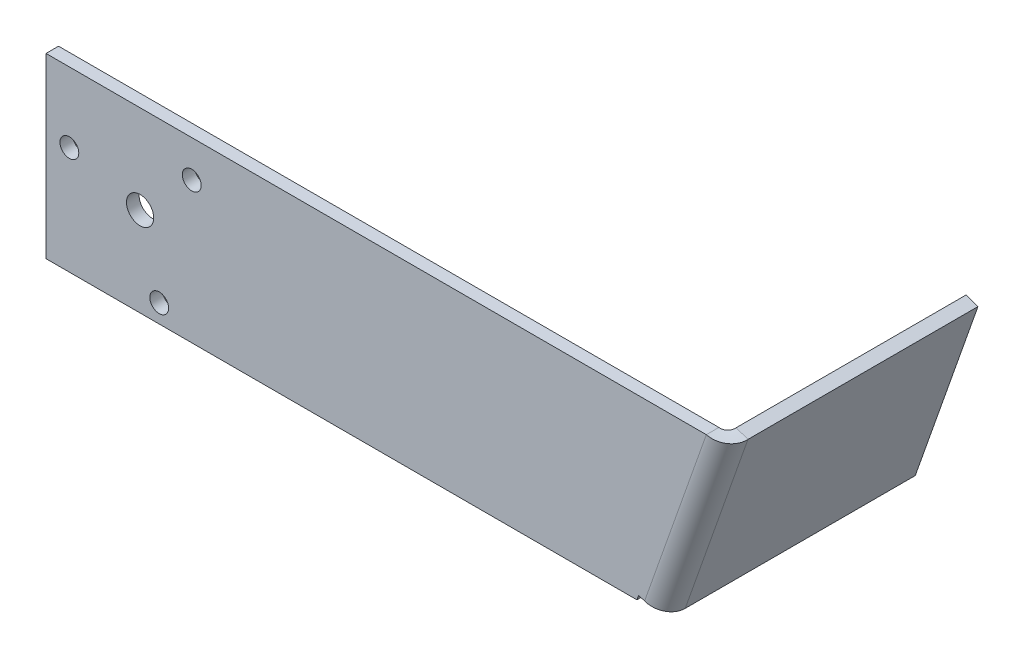
ISO-10303-21;
HEADER;
FILE_DESCRIPTION(('STEP AP214'),'2;1');
FILE_NAME('part.step','',(''),(''),'','','');
FILE_SCHEMA(('AUTOMOTIVE_DESIGN { 1 0 10303 214 1 1 1 1 }'));
ENDSEC;
DATA;
#1=APPLICATION_CONTEXT('core data for automotive mechanical design processes');
#2=APPLICATION_PROTOCOL_DEFINITION('international standard','automotive_design',2000,#1);
#3=PRODUCT_CONTEXT('',#1,'mechanical');
#4=PRODUCT('Part','Part','',(#3));
#5=PRODUCT_RELATED_PRODUCT_CATEGORY('part','',(#4));
#6=PRODUCT_DEFINITION_FORMATION('','',#4);
#7=PRODUCT_DEFINITION_CONTEXT('part definition',#1,'design');
#8=PRODUCT_DEFINITION('design','',#6,#7);
#9=PRODUCT_DEFINITION_SHAPE('','',#8);
#10=(LENGTH_UNIT() NAMED_UNIT(*) SI_UNIT(.MILLI.,.METRE.));
#11=(NAMED_UNIT(*) PLANE_ANGLE_UNIT() SI_UNIT($,.RADIAN.));
#12=(NAMED_UNIT(*) SI_UNIT($,.STERADIAN.) SOLID_ANGLE_UNIT());
#13=UNCERTAINTY_MEASURE_WITH_UNIT(LENGTH_MEASURE(1.E-05),#10,'distance_accuracy_value','');
#14=(GEOMETRIC_REPRESENTATION_CONTEXT(3) GLOBAL_UNCERTAINTY_ASSIGNED_CONTEXT((#13)) GLOBAL_UNIT_ASSIGNED_CONTEXT((#10,
#11,#12)) REPRESENTATION_CONTEXT('',''));
#15=CARTESIAN_POINT('',(0.,0.,0.));
#16=DIRECTION('',(0.,0.,1.));
#17=DIRECTION('',(1.,0.,0.));
#18=AXIS2_PLACEMENT_3D('',#15,#16,#17);
#19=CARTESIAN_POINT('',(0.,-85.,-6.));
#20=DIRECTION('',(0.,-1.,0.));
#21=DIRECTION('',(1.,0.,0.));
#22=AXIS2_PLACEMENT_3D('',#19,#20,#21);
#23=PLANE('',#22);
#24=DIRECTION('',(1.,0.,0.));
#25=VECTOR('',#24,1.);
#26=CARTESIAN_POINT('',(0.,-85.,-6.));
#27=LINE('',#26,#25);
#28=CARTESIAN_POINT('',(0.,-85.,-6.));
#29=VERTEX_POINT('',#28);
#30=CARTESIAN_POINT('',(282.576806197574,-85.,-6.00000000000002));
#31=VERTEX_POINT('',#30);
#32=EDGE_CURVE('E131',#29,#31,#27,.T.);
#33=ORIENTED_EDGE('',*,*,#32,.T.);
#34=DIRECTION('',(0.,0.,1.));
#35=VECTOR('',#34,1.);
#36=CARTESIAN_POINT('',(282.576806197574,-85.,-6.));
#37=LINE('',#36,#35);
#38=CARTESIAN_POINT('',(282.576806197574,-85.,0.));
#39=VERTEX_POINT('',#38);
#40=EDGE_CURVE('E91',#31,#39,#37,.T.);
#41=ORIENTED_EDGE('',*,*,#40,.T.);
#42=DIRECTION('',(1.,0.,0.));
#43=VECTOR('',#42,1.);
#44=CARTESIAN_POINT('',(0.,-85.,0.));
#45=LINE('',#44,#43);
#46=CARTESIAN_POINT('',(0.,-85.,0.));
#47=VERTEX_POINT('',#46);
#48=EDGE_CURVE('E81',#47,#39,#45,.T.);
#49=ORIENTED_EDGE('',*,*,#48,.F.);
#50=DIRECTION('',(0.,0.,1.));
#51=VECTOR('',#50,1.);
#52=CARTESIAN_POINT('',(0.,-85.,-6.));
#53=LINE('',#52,#51);
#54=EDGE_CURVE('E88',#29,#47,#53,.T.);
#55=ORIENTED_EDGE('',*,*,#54,.F.);
#56=EDGE_LOOP('',(#33,#41,#49,#55));
#57=FACE_BOUND('',#56,.T.);
#58=ADVANCED_FACE('F34',(#57),#23,.T.);
#59=CARTESIAN_POINT('',(0.,-85.,-6.));
#60=DIRECTION('',(0.,0.,1.));
#61=DIRECTION('',(1.,0.,0.));
#62=AXIS2_PLACEMENT_3D('',#59,#60,#61);
#63=PLANE('',#62);
#64=CARTESIAN_POINT('',(54.1334086420687,-76.1877716395285,-6.));
#65=DIRECTION('',(0.,0.,1.));
#66=DIRECTION('',(1.,0.,0.));
#67=AXIS2_PLACEMENT_3D('',#64,#65,#66);
#68=CIRCLE('',#67,4.5);
#69=CARTESIAN_POINT('',(58.6334086420687,-76.1877716395285,-6.));
#70=VERTEX_POINT('',#69);
#71=EDGE_CURVE('E328',#70,#70,#68,.T.);
#72=ORIENTED_EDGE('',*,*,#71,.T.);
#73=EDGE_LOOP('',(#72));
#74=FACE_BOUND('',#73,.T.);
#75=CARTESIAN_POINT('',(11.172645738598,-33.4166031875001,-6.));
#76=DIRECTION('',(0.,0.,1.));
#77=DIRECTION('',(1.,0.,0.));
#78=AXIS2_PLACEMENT_3D('',#75,#76,#77);
#79=CIRCLE('',#78,4.5);
#80=CARTESIAN_POINT('',(15.672645738598,-33.4166031875001,-6.));
#81=VERTEX_POINT('',#80);
#82=EDGE_CURVE('E322',#81,#81,#79,.T.);
#83=ORIENTED_EDGE('',*,*,#82,.T.);
#84=EDGE_LOOP('',(#83));
#85=FACE_BOUND('',#84,.T.);
#86=CARTESIAN_POINT('',(69.6939456193336,-17.5970753731488,-6.));
#87=DIRECTION('',(0.,0.,1.));
#88=DIRECTION('',(1.,0.,0.));
#89=AXIS2_PLACEMENT_3D('',#86,#87,#88);
#90=CIRCLE('',#89,4.5);
#91=CARTESIAN_POINT('',(74.1939456193336,-17.5970753731488,-6.));
#92=VERTEX_POINT('',#91);
#93=EDGE_CURVE('E314',#92,#92,#90,.T.);
#94=ORIENTED_EDGE('',*,*,#93,.T.);
#95=EDGE_LOOP('',(#94));
#96=FACE_BOUND('',#95,.T.);
#97=CARTESIAN_POINT('',(45.,-42.4004834000591,-6.));
#98=DIRECTION('',(0.,0.,1.));
#99=DIRECTION('',(1.,0.,0.));
#100=AXIS2_PLACEMENT_3D('',#97,#98,#99);
#101=CIRCLE('',#100,6.5);
#102=CARTESIAN_POINT('',(51.5,-42.4004834000591,-6.));
#103=VERTEX_POINT('',#102);
#104=EDGE_CURVE('E271',#103,#103,#101,.T.);
#105=ORIENTED_EDGE('',*,*,#104,.T.);
#106=EDGE_LOOP('',(#105));
#107=FACE_BOUND('',#106,.T.);
#108=DIRECTION('',(0.332820117735131,0.942990333582892,0.));
#109=VECTOR('',#108,1.);
#110=CARTESIAN_POINT('',(282.400607311714,-85.4992301766027,-6.00000000000002));
#111=LINE('',#110,#109);
#112=CARTESIAN_POINT('',(283.39906766492,-82.6702591758541,-6.00000000000002));
#113=VERTEX_POINT('',#112);
#114=EDGE_CURVE('E95',#31,#113,#111,.T.);
#115=ORIENTED_EDGE('',*,*,#114,.F.);
#116=ORIENTED_EDGE('',*,*,#32,.F.);
#117=DIRECTION('',(0.,-1.,0.));
#118=VECTOR('',#117,1.);
#119=CARTESIAN_POINT('',(0.,0.,-6.));
#120=LINE('',#119,#118);
#121=CARTESIAN_POINT('',(0.,0.,-6.));
#122=VERTEX_POINT('',#121);
#123=EDGE_CURVE('E80',#122,#29,#120,.T.);
#124=ORIENTED_EDGE('',*,*,#123,.F.);
#125=DIRECTION('',(-1.,0.,0.));
#126=VECTOR('',#125,1.);
#127=CARTESIAN_POINT('',(0.,0.,-6.));
#128=LINE('',#127,#126);
#129=CARTESIAN_POINT('',(315.758174970042,0.,-6.00000000000002));
#130=VERTEX_POINT('',#129);
#131=EDGE_CURVE('E58',#130,#122,#128,.T.);
#132=ORIENTED_EDGE('',*,*,#131,.F.);
#133=DIRECTION('',(-0.332820117735138,-0.942990333582889,0.));
#134=VECTOR('',#133,1.);
#135=CARTESIAN_POINT('',(286.228038665668,-83.6687195290595,-6.00000000000002));
#136=LINE('',#135,#134);
#137=CARTESIAN_POINT('',(286.228038665668,-83.6687195290595,-6.00000000000002));
#138=VERTEX_POINT('',#137);
#139=EDGE_CURVE('E149',#138,#130,#136,.F.);
#140=ORIENTED_EDGE('',*,*,#139,.F.);
#141=DIRECTION('',(0.94299033358289,-0.332820117735136,0.));
#142=VECTOR('',#141,1.);
#143=CARTESIAN_POINT('',(283.39906766492,-82.6702591758541,-6.00000000000002));
#144=LINE('',#143,#142);
#145=EDGE_CURVE('E124',#113,#138,#144,.T.);
#146=ORIENTED_EDGE('',*,*,#145,.F.);
#147=EDGE_LOOP('',(#115,#116,#124,#132,#140,#146));
#148=FACE_BOUND('',#147,.T.);
#149=ADVANCED_FACE('F137',(#74,#85,#96,#107,#148),#63,.F.);
#150=CARTESIAN_POINT('',(0.,-85.,0.));
#151=DIRECTION('',(0.,0.,1.));
#152=DIRECTION('',(1.,0.,0.));
#153=AXIS2_PLACEMENT_3D('',#150,#151,#152);
#154=PLANE('',#153);
#155=CARTESIAN_POINT('',(54.1334086420687,-76.1877716395285,0.));
#156=DIRECTION('',(0.,0.,1.));
#157=DIRECTION('',(-0.499999999999992,-0.866025403784443,0.));
#158=AXIS2_PLACEMENT_3D('',#155,#156,#157);
#159=CIRCLE('',#158,4.5);
#160=CARTESIAN_POINT('',(51.8834086420687,-80.0848859565585,0.));
#161=VERTEX_POINT('',#160);
#162=EDGE_CURVE('E331',#161,#161,#159,.T.);
#163=ORIENTED_EDGE('',*,*,#162,.F.);
#164=EDGE_LOOP('',(#163));
#165=FACE_BOUND('',#164,.T.);
#166=CARTESIAN_POINT('',(11.172645738598,-33.4166031875001,0.));
#167=DIRECTION('',(0.,0.,1.));
#168=DIRECTION('',(-0.500000000000004,0.866025403784436,0.));
#169=AXIS2_PLACEMENT_3D('',#166,#167,#168);
#170=CIRCLE('',#169,4.5);
#171=CARTESIAN_POINT('',(8.92264573859799,-29.5194888704701,0.));
#172=VERTEX_POINT('',#171);
#173=EDGE_CURVE('E325',#172,#172,#170,.T.);
#174=ORIENTED_EDGE('',*,*,#173,.F.);
#175=EDGE_LOOP('',(#174));
#176=FACE_BOUND('',#175,.T.);
#177=CARTESIAN_POINT('',(69.6939456193336,-17.5970753731488,0.));
#178=DIRECTION('',(0.,0.,1.));
#179=DIRECTION('',(1.,0.,0.));
#180=AXIS2_PLACEMENT_3D('',#177,#178,#179);
#181=CIRCLE('',#180,4.5);
#182=CARTESIAN_POINT('',(74.1939456193336,-17.5970753731488,0.));
#183=VERTEX_POINT('',#182);
#184=EDGE_CURVE('E319',#183,#183,#181,.T.);
#185=ORIENTED_EDGE('',*,*,#184,.F.);
#186=EDGE_LOOP('',(#185));
#187=FACE_BOUND('',#186,.T.);
#188=CARTESIAN_POINT('',(45.,-42.4004834000591,0.));
#189=DIRECTION('',(0.,0.,1.));
#190=DIRECTION('',(1.,0.,0.));
#191=AXIS2_PLACEMENT_3D('',#188,#189,#190);
#192=CIRCLE('',#191,6.5);
#193=CARTESIAN_POINT('',(51.5,-42.4004834000591,0.));
#194=VERTEX_POINT('',#193);
#195=EDGE_CURVE('E310',#194,#194,#192,.T.);
#196=ORIENTED_EDGE('',*,*,#195,.F.);
#197=EDGE_LOOP('',(#196));
#198=FACE_BOUND('',#197,.T.);
#199=ORIENTED_EDGE('',*,*,#48,.T.);
#200=DIRECTION('',(0.332820117735131,0.942990333582892,0.));
#201=VECTOR('',#200,1.);
#202=CARTESIAN_POINT('',(251.275990741844,-173.685643791237,0.));
#203=LINE('',#202,#201);
#204=CARTESIAN_POINT('',(283.39906766492,-82.6702591758541,0.));
#205=VERTEX_POINT('',#204);
#206=EDGE_CURVE('E11',#39,#205,#203,.T.);
#207=ORIENTED_EDGE('',*,*,#206,.T.);
#208=DIRECTION('',(0.94299033358289,-0.332820117735136,0.));
#209=VECTOR('',#208,1.);
#210=CARTESIAN_POINT('',(32.1230769230766,6.01538461538423,0.));
#211=LINE('',#210,#209);
#212=CARTESIAN_POINT('',(286.228038665668,-83.6687195290595,0.));
#213=VERTEX_POINT('',#212);
#214=EDGE_CURVE('E42',#205,#213,#211,.T.);
#215=ORIENTED_EDGE('',*,*,#214,.T.);
#216=DIRECTION('',(-0.332820117735138,-0.942990333582889,0.));
#217=VECTOR('',#216,1.);
#218=CARTESIAN_POINT('',(286.228038665668,-83.6687195290595,0.));
#219=LINE('',#218,#217);
#220=CARTESIAN_POINT('',(315.758174970042,0.,0.));
#221=VERTEX_POINT('',#220);
#222=EDGE_CURVE('E79',#213,#221,#219,.F.);
#223=ORIENTED_EDGE('',*,*,#222,.T.);
#224=DIRECTION('',(-1.,0.,0.));
#225=VECTOR('',#224,1.);
#226=CARTESIAN_POINT('',(0.,0.,0.));
#227=LINE('',#226,#225);
#228=CARTESIAN_POINT('',(0.,0.,0.));
#229=VERTEX_POINT('',#228);
#230=EDGE_CURVE('E73',#221,#229,#227,.T.);
#231=ORIENTED_EDGE('',*,*,#230,.T.);
#232=DIRECTION('',(0.,-1.,0.));
#233=VECTOR('',#232,1.);
#234=CARTESIAN_POINT('',(0.,0.,0.));
#235=LINE('',#234,#233);
#236=EDGE_CURVE('E77',#229,#47,#235,.T.);
#237=ORIENTED_EDGE('',*,*,#236,.T.);
#238=EDGE_LOOP('',(#199,#207,#215,#223,#231,#237));
#239=FACE_BOUND('',#238,.T.);
#240=ADVANCED_FACE('F75',(#165,#176,#187,#198,#239),#154,.T.);
#241=CARTESIAN_POINT('',(0.,0.,-6.));
#242=DIRECTION('',(-1.,0.,0.));
#243=DIRECTION('',(0.,-1.,0.));
#244=AXIS2_PLACEMENT_3D('',#241,#242,#243);
#245=PLANE('',#244);
#246=ORIENTED_EDGE('',*,*,#236,.F.);
#247=DIRECTION('',(0.,0.,1.));
#248=VECTOR('',#247,1.);
#249=CARTESIAN_POINT('',(0.,0.,-6.));
#250=LINE('',#249,#248);
#251=EDGE_CURVE('E83',#122,#229,#250,.T.);
#252=ORIENTED_EDGE('',*,*,#251,.F.);
#253=ORIENTED_EDGE('',*,*,#123,.T.);
#254=ORIENTED_EDGE('',*,*,#54,.T.);
#255=EDGE_LOOP('',(#246,#252,#253,#254));
#256=FACE_BOUND('',#255,.T.);
#257=ADVANCED_FACE('F36',(#256),#245,.T.);
#258=CARTESIAN_POINT('',(0.,0.,-6.));
#259=DIRECTION('',(0.,1.,0.));
#260=DIRECTION('',(0.,0.,1.));
#261=AXIS2_PLACEMENT_3D('',#258,#259,#260);
#262=PLANE('',#261);
#263=DIRECTION('',(0.,0.,1.));
#264=VECTOR('',#263,1.);
#265=CARTESIAN_POINT('',(315.758174970042,0.,-6.00000000000002));
#266=LINE('',#265,#264);
#267=EDGE_CURVE('E125',#130,#221,#266,.T.);
#268=ORIENTED_EDGE('',*,*,#267,.F.);
#269=ORIENTED_EDGE('',*,*,#131,.T.);
#270=ORIENTED_EDGE('',*,*,#251,.T.);
#271=ORIENTED_EDGE('',*,*,#230,.F.);
#272=EDGE_LOOP('',(#268,#269,#270,#271));
#273=FACE_BOUND('',#272,.T.);
#274=ADVANCED_FACE('F84',(#273),#262,.T.);
#275=CARTESIAN_POINT('',(282.400607311714,-85.4992301766027,-6.00000000000002));
#276=DIRECTION('',(0.942990333582892,-0.332820117735131,0.));
#277=DIRECTION('',(0.332820117735131,0.942990333582892,0.));
#278=AXIS2_PLACEMENT_3D('',#275,#276,#277);
#279=PLANE('',#278);
#280=ORIENTED_EDGE('',*,*,#40,.F.);
#281=ORIENTED_EDGE('',*,*,#114,.T.);
#282=DIRECTION('',(0.,0.,1.));
#283=VECTOR('',#282,1.);
#284=CARTESIAN_POINT('',(283.39906766492,-82.6702591758541,-6.00000000000002));
#285=LINE('',#284,#283);
#286=EDGE_CURVE('E113',#113,#205,#285,.T.);
#287=ORIENTED_EDGE('',*,*,#286,.T.);
#288=ORIENTED_EDGE('',*,*,#206,.F.);
#289=EDGE_LOOP('',(#280,#281,#287,#288));
#290=FACE_BOUND('',#289,.T.);
#291=ADVANCED_FACE('F122',(#290),#279,.T.);
#292=CARTESIAN_POINT('',(283.39906766492,-82.6702591758541,-6.00000000000002));
#293=DIRECTION('',(-0.332820117735136,-0.94299033358289,0.));
#294=DIRECTION('',(0.94299033358289,-0.332820117735136,0.));
#295=AXIS2_PLACEMENT_3D('',#292,#293,#294);
#296=PLANE('',#295);
#297=ORIENTED_EDGE('',*,*,#214,.F.);
#298=ORIENTED_EDGE('',*,*,#286,.F.);
#299=ORIENTED_EDGE('',*,*,#145,.T.);
#300=DIRECTION('',(0.,0.,1.));
#301=VECTOR('',#300,1.);
#302=CARTESIAN_POINT('',(286.228038665668,-83.6687195290595,-6.00000000000002));
#303=LINE('',#302,#301);
#304=EDGE_CURVE('E116',#138,#213,#303,.T.);
#305=ORIENTED_EDGE('',*,*,#304,.T.);
#306=EDGE_LOOP('',(#297,#298,#299,#305));
#307=FACE_BOUND('',#306,.T.);
#308=ADVANCED_FACE('F111',(#307),#296,.T.);
#309=CARTESIAN_POINT('',(315.758174970042,0.,0.0599999999999766));
#310=CARTESIAN_POINT('',(317.039337103569,-0.327392988376116,0.0599999999999639));
#311=CARTESIAN_POINT('',(318.319552377333,-0.654496436105024,-0.201834872716784));
#312=CARTESIAN_POINT('',(320.692368974722,-1.24244199812715,-1.20970893315621));
#313=CARTESIAN_POINT('',(321.783838371589,-1.50290693143443,-1.95535156547435));
#314=CARTESIAN_POINT('',(323.618287836655,-1.90084056440129,-3.81765999705238));
#315=CARTESIAN_POINT('',(324.360576939207,-2.03806539383271,-4.93359305746879));
#316=CARTESIAN_POINT('',(325.389303051608,-2.15162607880025,-7.36681628334566));
#317=CARTESIAN_POINT('',(325.675359107689,-2.12784980264109,-8.68291351939514));
#318=CARTESIAN_POINT('',(325.714521421512,-2.01688991347492,-9.99999999999998));
#319=CARTESIAN_POINT('',(315.758174970042,0.,0.));
#320=CARTESIAN_POINT('',(317.031929511708,-0.324778553197858,0.));
#321=CARTESIAN_POINT('',(318.304742833846,-0.649269538403661,-0.260273233316883));
#322=CARTESIAN_POINT('',(320.663874504904,-1.2323851264267,-1.26213611645746));
#323=CARTESIAN_POINT('',(321.749067674601,-1.49063492073269,-2.00333157601824));
#324=CARTESIAN_POINT('',(323.573043150507,-1.88487185164314,-3.85453280025088));
#325=CARTESIAN_POINT('',(324.311138612137,-2.02061657251386,-4.96381019629105));
#326=CARTESIAN_POINT('',(325.334196242452,-2.13217661674508,-7.38252115640721));
#327=CARTESIAN_POINT('',(325.618779690501,-2.10788058756689,-8.6907689435388));
#328=CARTESIAN_POINT('',(325.657942001497,-1.99692070641081,-9.99999999999998));
#329=CARTESIAN_POINT('',(315.758174970042,0.,-6.00000000000002));
#330=CARTESIAN_POINT('',(316.291170325632,-0.0633350353721105,-6.00000000000003));
#331=CARTESIAN_POINT('',(316.823788485126,-0.126579768267377,-6.10410929332677));
#332=CARTESIAN_POINT('',(317.814427523112,-0.226697956382541,-6.50485444658301));
#333=CARTESIAN_POINT('',(318.271997975772,-0.263433850557907,-6.80133263040732));
#334=CARTESIAN_POINT('',(319.048574535697,-0.288000575828033,-7.54181312010037));
#335=CARTESIAN_POINT('',(319.367305905131,-0.275734440629289,-7.98552407851643));
#336=CARTESIAN_POINT('',(319.823515326819,-0.187230411227724,-8.9530084625629));
#337=CARTESIAN_POINT('',(319.960837971713,-0.110959080146464,-9.47631135790488));
#338=CARTESIAN_POINT('',(320.,0.,-10.));
#339=CARTESIAN_POINT('',(315.758174970042,0.,-6.06060000000002));
#340=CARTESIAN_POINT('',(316.283688657853,-0.0606944558420704,-6.06060000000003));
#341=CARTESIAN_POINT('',(316.808830846204,-0.121300601589001,-6.16313203753287));
#342=CARTESIAN_POINT('',(317.785648108596,-0.216540515965094,-6.55780590171727));
#343=CARTESIAN_POINT('',(318.236879571814,-0.251039119749142,-6.84979244105664));
#344=CARTESIAN_POINT('',(319.002877402688,-0.2718721759423,-7.57905465133085));
#345=CARTESIAN_POINT('',(319.31737319479,-0.258111131097255,-8.01604338872691));
#346=CARTESIAN_POINT('',(319.767857449571,-0.167586454551998,-8.96887038435507));
#347=CARTESIAN_POINT('',(319.903692760353,-0.0907901729215177,-9.48424533628998));
#348=CARTESIAN_POINT('',(319.942854785785,0.0201688991347788,-10.));
#349=B_SPLINE_SURFACE_WITH_KNOTS('',1,3,((#309,#310,#311,#312,#313,#314,#315,#316,#317,#318),
(#319,#320,#321,#322,#323,#324,#325,#326,#327,#328),(#329,#330,#331,#332,#333,#334,#335,#336,
#337,#338),(#339,#340,#341,#342,#343,#344,#345,#346,#347,#348)),.UNSPECIFIED.,.F.,.F.,.F.,(2,1,
1,2),(4,2,2,2,4),(-0.01,0.,1.,1.0101),(0.,0.25,0.5,0.75,1.),.UNSPECIFIED.);
#350=DIRECTION('',(0.942990333582889,-0.332820117735138,0.));
#351=VECTOR('',#350,1.);
#352=CARTESIAN_POINT('',(320.,0.,-10.));
#353=LINE('',#352,#351);
#354=CARTESIAN_POINT('',(320.,0.,-10.));
#355=VERTEX_POINT('',#354);
#356=CARTESIAN_POINT('',(325.657942001497,-1.9969207064108,-9.99999999999999));
#357=VERTEX_POINT('',#356);
#358=EDGE_CURVE('E266',#355,#357,#353,.T.);
#359=CARTESIAN_POINT('',(315.758174970042,0.,-6.00000000000002));
#360=CARTESIAN_POINT('',(315.875576456683,-0.0139496043659797,-5.99998664061451));
#361=CARTESIAN_POINT('',(315.992976036293,-0.0278990341707674,-6.00498914811425));
#362=CARTESIAN_POINT('',(316.226956554822,-0.0555115373283939,-6.0249294323328));
#363=CARTESIAN_POINT('',(316.343537534778,-0.0691746251054043,-6.0398667073515));
#364=CARTESIAN_POINT('',(316.574988513972,-0.0959195574198467,-6.07956472354093));
#365=CARTESIAN_POINT('',(316.689859766705,-0.109001843301677,-6.10431785859973));
#366=CARTESIAN_POINT('',(316.917189343699,-0.134312631766085,-6.16345809799023));
#367=CARTESIAN_POINT('',(317.029647698867,-0.146541145289044,-6.19784507884389));
#368=CARTESIAN_POINT('',(317.251413712725,-0.169877305129596,-6.27601046754627));
#369=CARTESIAN_POINT('',(317.360720321416,-0.180984580921745,-6.31979196507491));
#370=CARTESIAN_POINT('',(317.575431719063,-0.201811441623518,-6.41643009573578));
#371=CARTESIAN_POINT('',(317.680835050315,-0.211530511894406,-6.46929007855309));
#372=CARTESIAN_POINT('',(317.886913369747,-0.229318367578876,-6.5836459921944));
#373=CARTESIAN_POINT('',(317.987591059391,-0.237388104925629,-6.6451369068004));
#374=CARTESIAN_POINT('',(318.18363225188,-0.251640976559468,-6.77634234911625));
#375=CARTESIAN_POINT('',(318.278993785634,-0.257823415541569,-6.84605989453869));
#376=CARTESIAN_POINT('',(318.463660238666,-0.268064902225483,-6.9931359329333));
#377=CARTESIAN_POINT('',(318.552968676704,-0.272125192940986,-7.07048992134256));
#378=CARTESIAN_POINT('',(318.725017416752,-0.277918336252537,-7.23232395786446));
#379=CARTESIAN_POINT('',(318.807755424545,-0.279650379219465,-7.31680647401645));
#380=CARTESIAN_POINT('',(318.966083341592,-0.28058973408987,-7.49225272201073));
#381=CARTESIAN_POINT('',(319.041672484806,-0.279796775740203,-7.58321714659876));
#382=CARTESIAN_POINT('',(319.185192085698,-0.275509416147546,-7.77093960758537));
#383=CARTESIAN_POINT('',(319.253122541342,-0.272015014187689,-7.86769764552137));
#384=CARTESIAN_POINT('',(319.380912591006,-0.26216221039789,-8.06633054220654));
#385=CARTESIAN_POINT('',(319.440768359631,-0.255802457252331,-8.16820779504174));
#386=CARTESIAN_POINT('',(319.55196828308,-0.240088466702117,-8.3762390512485));
#387=CARTESIAN_POINT('',(319.603315382271,-0.230735268456352,-8.48239155932519));
#388=CARTESIAN_POINT('',(319.697178067365,-0.208926272940527,-8.69815481233361));
#389=CARTESIAN_POINT('',(319.739698462494,-0.196472173373923,-8.80776363639339));
#390=CARTESIAN_POINT('',(319.815677773655,-0.168377797847137,-9.02963804743631));
#391=CARTESIAN_POINT('',(319.849139588493,-0.15273854397178,-9.14190277197865));
#392=CARTESIAN_POINT('',(319.909278024659,-0.116734428534193,-9.37789572759362));
#393=CARTESIAN_POINT('',(319.935138656774,-0.0960813013422043,-9.50178877632723));
#394=CARTESIAN_POINT('',(319.97583395767,-0.0509327730276205,-9.75045667169592));
#395=CARTESIAN_POINT('',(319.990687310984,-0.0264439688711758,-9.87522965942069));
#396=CARTESIAN_POINT('',(320.,0.,-10.));
#397=B_SPLINE_CURVE_WITH_KNOTS('',3,(#359,#360,#361,#362,#363,#364,#365,#366,#367,#368,#369,
#370,#371,#372,#373,#374,#375,#376,#377,#378,#379,#380,#381,#382,#383,#384,#385,#386,#387,#388,
#389,#390,#391,#392,#393,#394,#395,#396),.UNSPECIFIED.,.F.,.F.,(4,2,2,2,2,2,2,2,2,2,2,2,2,2,2,2,
2,2,4),(0.,0.354573494221407,0.709129084042459,1.06341047106588,1.41768731743441,
1.77208085786967,2.12660544077535,2.48092482392769,2.83537458579605,3.18961650117692,
3.5439815694481,3.89838456700349,4.25278765860484,4.60735806391881,4.96180551522859,
5.3160593361993,5.67019965919018,6.05437050046852,6.43788771982074),.UNSPECIFIED.);
#398=EDGE_CURVE('E140',#130,#355,#397,.T.);
#399=CARTESIAN_POINT('',(315.758174970042,0.,0.));
#400=CARTESIAN_POINT('',(316.006327820017,-0.0632725972516841,2.02510476763671E-05));
#401=CARTESIAN_POINT('',(316.254477395989,-0.126544165275616,-0.00975788691844029));
#402=CARTESIAN_POINT('',(316.749343421884,-0.252584952148873,-0.0487624741568807));
#403=CARTESIAN_POINT('',(316.996060023562,-0.315354224468696,-0.0779868246971116));
#404=CARTESIAN_POINT('',(317.48670069864,-0.439907301725892,-0.155737492089782));
#405=CARTESIAN_POINT('',(317.730624623171,-0.501691054196836,-0.204264833038047));
#406=CARTESIAN_POINT('',(318.214295823114,-0.623782053103872,-0.320332265546974));
#407=CARTESIAN_POINT('',(318.454042792989,-0.684089191658439,-0.387873741803155));
#408=CARTESIAN_POINT('',(318.953272101012,-0.809073920710985,-0.549778757877395));
#409=CARTESIAN_POINT('',(319.212133788409,-0.873532080848013,-0.646234042570173));
#410=CARTESIAN_POINT('',(319.721269252824,-0.999417084422529,-0.861261787270711));
#411=CARTESIAN_POINT('',(319.971542706948,-1.06084381392426,-0.979835077780236));
#412=CARTESIAN_POINT('',(320.461768019539,-1.18005536813722,-1.23824943569832));
#413=CARTESIAN_POINT('',(320.70171983207,-1.23784017664049,-1.37809059774767));
#414=CARTESIAN_POINT('',(321.169634128014,-1.34918036811135,-1.67803441696304));
#415=CARTESIAN_POINT('',(321.397596855974,-1.40273583735746,-1.83813666062951));
#416=CARTESIAN_POINT('',(321.839956806787,-1.50505768067369,-2.1774498835992));
#417=CARTESIAN_POINT('',(322.054354627995,-1.55382426603628,-2.35666001910635));
#418=CARTESIAN_POINT('',(322.468120668299,-1.64605266937266,-2.73291208915954));
#419=CARTESIAN_POINT('',(322.667488766437,-1.68951444465536,-2.92995416718806));
#420=CARTESIAN_POINT('',(323.049844530334,-1.77065337952065,-3.34047740059547));
#421=CARTESIAN_POINT('',(323.23283055701,-1.80832996054355,-3.55396019695909));
#422=CARTESIAN_POINT('',(323.581145499585,-1.87745411782789,-3.995814339984));
#423=CARTESIAN_POINT('',(323.746474645446,-1.90890177521942,-4.22418549267681));
#424=CARTESIAN_POINT('',(324.058378065438,-1.96517352971141,-4.69421806030922));
#425=CARTESIAN_POINT('',(324.204949549866,-1.98999664218187,-4.93588144449004));
#426=CARTESIAN_POINT('',(324.478320103142,-2.03266196750305,-5.43073230546428));
#427=CARTESIAN_POINT('',(324.6051189576,-2.05050410466341,-5.68391990717435));
#428=CARTESIAN_POINT('',(324.838059584168,-2.0789050624526,-6.19994151164458));
#429=CARTESIAN_POINT('',(324.944207634371,-2.08946609911465,-6.46277255371094));
#430=CARTESIAN_POINT('',(325.135168719046,-2.10306861124273,-6.99615131639658));
#431=CARTESIAN_POINT('',(325.219985738852,-2.10611149228447,-7.26669758502743));
#432=CARTESIAN_POINT('',(325.402385450561,-2.10409377976759,-7.9419326299137));
#433=CARTESIAN_POINT('',(325.487360806681,-2.09457352236609,-8.35013555875621));
#434=CARTESIAN_POINT('',(325.578542646141,-2.06753697322661,-8.96668256662238));
#435=CARTESIAN_POINT('',(325.602887498492,-2.05640502258155,-9.17283084741845));
#436=CARTESIAN_POINT('',(325.639489906879,-2.02987095697412,-9.58596375563406));
#437=CARTESIAN_POINT('',(325.651745174927,-2.01446803442477,-9.79294853392348));
#438=CARTESIAN_POINT('',(325.657942001497,-1.99692070641081,-9.99999999999998));
#439=B_SPLINE_CURVE_WITH_KNOTS('',3,(#399,#400,#401,#402,#403,#404,#405,#406,#407,#408,#409,
#410,#411,#412,#413,#414,#415,#416,#417,#418,#419,#420,#421,#422,#423,#424,#425,#426,#427,#428,
#429,#430,#431,#432,#433,#434,#435,#436,#437,#438),.UNSPECIFIED.,.F.,.F.,(4,2,2,2,2,2,2,2,2,2,2,
2,2,2,2,2,2,2,2,4),(0.,0.768084951560631,1.53608702101079,2.30412984127834,3.07222860838071,
3.92220822002024,4.77221975369306,5.62223506997888,6.47223304147127,7.32219349296169,
8.17216078416013,9.02221302271755,9.87225418883757,10.7224216293609,11.572598287463,
12.4225160763972,13.2722749547839,14.5197810241945,15.1430883400825,15.7665135959967),.UNSPECIFIED.);
#440=EDGE_CURVE('E49',#221,#357,#439,.T.);
#441=ORIENTED_EDGE('',*,*,#358,.F.);
#442=ORIENTED_EDGE('',*,*,#398,.F.);
#443=ORIENTED_EDGE('',*,*,#267,.T.);
#444=ORIENTED_EDGE('',*,*,#440,.T.);
#445=EDGE_LOOP('',(#441,#442,#443,#444));
#446=FACE_BOUND('',#445,.T.);
#447=ADVANCED_FACE('F154',(#446),#349,.F.);
#448=CARTESIAN_POINT('',(286.228038665668,-83.6687195290595,-10.));
#449=DIRECTION('',(0.332820117735138,0.942990333582889,0.));
#450=DIRECTION('',(-0.942990333582889,0.332820117735138,0.));
#451=AXIS2_PLACEMENT_3D('',#448,#449,#450);
#452=PLANE('',#451);
#453=CARTESIAN_POINT('',(286.228038665668,-83.6687195290595,-10.));
#454=DIRECTION('',(-0.332820117735138,-0.942990333582889,0.));
#455=DIRECTION('',(0.942990333582889,-0.332820117735138,0.));
#456=AXIS2_PLACEMENT_3D('',#453,#454,#455);
#457=CIRCLE('',#456,4.);
#458=CARTESIAN_POINT('',(290.,-85.,-10.));
#459=VERTEX_POINT('',#458);
#460=EDGE_CURVE('E232',#459,#138,#457,.T.);
#461=ORIENTED_EDGE('',*,*,#460,.F.);
#462=DIRECTION('',(0.942990333582889,-0.332820117735138,0.));
#463=VECTOR('',#462,1.);
#464=CARTESIAN_POINT('',(290.,-85.,-10.));
#465=LINE('',#464,#463);
#466=CARTESIAN_POINT('',(295.657942001497,-86.9969207064108,-9.99999999999998));
#467=VERTEX_POINT('',#466);
#468=EDGE_CURVE('E237',#459,#467,#465,.T.);
#469=ORIENTED_EDGE('',*,*,#468,.T.);
#470=CARTESIAN_POINT('',(286.228038665668,-83.6687195290595,-10.));
#471=DIRECTION('',(-0.332820117735138,-0.942990333582889,0.));
#472=DIRECTION('',(0.942990333582889,-0.332820117735138,0.));
#473=AXIS2_PLACEMENT_3D('',#470,#471,#472);
#474=CIRCLE('',#473,10.);
#475=EDGE_CURVE('E148',#467,#213,#474,.T.);
#476=ORIENTED_EDGE('',*,*,#475,.T.);
#477=ORIENTED_EDGE('',*,*,#304,.F.);
#478=EDGE_LOOP('',(#461,#469,#476,#477));
#479=FACE_BOUND('',#478,.T.);
#480=ADVANCED_FACE('F165',(#479),#452,.F.);
#481=CARTESIAN_POINT('',(286.228038665668,-83.6687195290595,-10.));
#482=DIRECTION('',(-0.332820117735138,-0.942990333582889,0.));
#483=DIRECTION('',(0.942990333582889,-0.332820117735138,0.));
#484=AXIS2_PLACEMENT_3D('',#481,#482,#483);
#485=CYLINDRICAL_SURFACE('',#484,10.);
#486=ORIENTED_EDGE('',*,*,#222,.F.);
#487=ORIENTED_EDGE('',*,*,#475,.F.);
#488=DIRECTION('',(-0.332820117735138,-0.942990333582889,0.));
#489=VECTOR('',#488,1.);
#490=CARTESIAN_POINT('',(295.657942001497,-86.9969207064108,-9.99999999999998));
#491=LINE('',#490,#489);
#492=EDGE_CURVE('E262',#357,#467,#491,.T.);
#493=ORIENTED_EDGE('',*,*,#492,.F.);
#494=ORIENTED_EDGE('',*,*,#440,.F.);
#495=EDGE_LOOP('',(#486,#487,#493,#494));
#496=FACE_BOUND('',#495,.T.);
#497=ADVANCED_FACE('F163',(#496),#485,.T.);
#498=CARTESIAN_POINT('',(286.228038665668,-83.6687195290595,-10.));
#499=DIRECTION('',(-0.332820117735138,-0.942990333582889,0.));
#500=DIRECTION('',(0.942990333582889,-0.332820117735138,0.));
#501=AXIS2_PLACEMENT_3D('',#498,#499,#500);
#502=CYLINDRICAL_SURFACE('',#501,4.);
#503=ORIENTED_EDGE('',*,*,#139,.T.);
#504=ORIENTED_EDGE('',*,*,#398,.T.);
#505=DIRECTION('',(-0.332820117735138,-0.942990333582889,0.));
#506=VECTOR('',#505,1.);
#507=CARTESIAN_POINT('',(320.,0.,-10.));
#508=LINE('',#507,#506);
#509=EDGE_CURVE('E251',#355,#459,#508,.T.);
#510=ORIENTED_EDGE('',*,*,#509,.T.);
#511=ORIENTED_EDGE('',*,*,#460,.T.);
#512=EDGE_LOOP('',(#503,#504,#510,#511));
#513=FACE_BOUND('',#512,.T.);
#514=ADVANCED_FACE('F159',(#513),#502,.F.);
#515=CARTESIAN_POINT('',(295.657942001497,-86.9969207064108,-5.99999999999998));
#516=DIRECTION('',(-0.332820117735138,-0.942990333582889,0.));
#517=DIRECTION('',(0.942990333582889,-0.332820117735138,0.));
#518=AXIS2_PLACEMENT_3D('',#515,#516,#517);
#519=PLANE('',#518);
#520=DIRECTION('',(0.,0.,1.));
#521=VECTOR('',#520,1.);
#522=CARTESIAN_POINT('',(295.657942001497,-86.9969207064108,-5.99999999999998));
#523=LINE('',#522,#521);
#524=CARTESIAN_POINT('',(295.657942001498,-86.996920706411,-120.));
#525=VERTEX_POINT('',#524);
#526=EDGE_CURVE('E261',#525,#467,#523,.T.);
#527=ORIENTED_EDGE('',*,*,#526,.T.);
#528=ORIENTED_EDGE('',*,*,#468,.F.);
#529=DIRECTION('',(0.,0.,1.));
#530=VECTOR('',#529,1.);
#531=CARTESIAN_POINT('',(290.,-85.,-6.));
#532=LINE('',#531,#530);
#533=CARTESIAN_POINT('',(290.,-85.0000000000002,-120.));
#534=VERTEX_POINT('',#533);
#535=EDGE_CURVE('E249',#534,#459,#532,.T.);
#536=ORIENTED_EDGE('',*,*,#535,.F.);
#537=DIRECTION('',(-0.942990333582889,0.332820117735138,0.));
#538=VECTOR('',#537,1.);
#539=CARTESIAN_POINT('',(295.657942001498,-86.996920706411,-120.));
#540=LINE('',#539,#538);
#541=EDGE_CURVE('E244',#525,#534,#540,.T.);
#542=ORIENTED_EDGE('',*,*,#541,.F.);
#543=EDGE_LOOP('',(#527,#528,#536,#542));
#544=FACE_BOUND('',#543,.T.);
#545=ADVANCED_FACE('F162',(#544),#519,.T.);
#546=CARTESIAN_POINT('',(325.657942001498,-1.996920706411,-120.));
#547=DIRECTION('',(0.332820117735138,0.942990333582889,0.));
#548=DIRECTION('',(-0.942990333582889,0.332820117735138,0.));
#549=AXIS2_PLACEMENT_3D('',#546,#547,#548);
#550=PLANE('',#549);
#551=DIRECTION('',(0.,0.,-1.));
#552=VECTOR('',#551,1.);
#553=CARTESIAN_POINT('',(320.,-1.66533453693773E-13,-120.));
#554=LINE('',#553,#552);
#555=CARTESIAN_POINT('',(320.,-1.66533453693773E-13,-120.));
#556=VERTEX_POINT('',#555);
#557=EDGE_CURVE('E264',#355,#556,#554,.T.);
#558=ORIENTED_EDGE('',*,*,#557,.F.);
#559=ORIENTED_EDGE('',*,*,#358,.T.);
#560=DIRECTION('',(0.,0.,-1.));
#561=VECTOR('',#560,1.);
#562=CARTESIAN_POINT('',(325.657942001498,-1.996920706411,-120.));
#563=LINE('',#562,#561);
#564=CARTESIAN_POINT('',(325.657942001498,-1.996920706411,-120.));
#565=VERTEX_POINT('',#564);
#566=EDGE_CURVE('E257',#357,#565,#563,.T.);
#567=ORIENTED_EDGE('',*,*,#566,.T.);
#568=DIRECTION('',(-0.942990333582889,0.332820117735138,0.));
#569=VECTOR('',#568,1.);
#570=CARTESIAN_POINT('',(325.657942001498,-1.996920706411,-120.));
#571=LINE('',#570,#569);
#572=EDGE_CURVE('E279',#565,#556,#571,.T.);
#573=ORIENTED_EDGE('',*,*,#572,.T.);
#574=EDGE_LOOP('',(#558,#559,#567,#573));
#575=FACE_BOUND('',#574,.T.);
#576=ADVANCED_FACE('F169',(#575),#550,.T.);
#577=CARTESIAN_POINT('',(295.657942001497,-86.9969207064108,-5.99999999999998));
#578=DIRECTION('',(0.942990333582889,-0.332820117735138,0.));
#579=DIRECTION('',(0.332820117735138,0.942990333582889,0.));
#580=AXIS2_PLACEMENT_3D('',#577,#578,#579);
#581=PLANE('',#580);
#582=ORIENTED_EDGE('',*,*,#566,.F.);
#583=ORIENTED_EDGE('',*,*,#492,.T.);
#584=ORIENTED_EDGE('',*,*,#526,.F.);
#585=DIRECTION('',(-0.332820117735138,-0.942990333582889,0.));
#586=VECTOR('',#585,1.);
#587=CARTESIAN_POINT('',(295.657942001498,-86.996920706411,-120.));
#588=LINE('',#587,#586);
#589=EDGE_CURVE('E275',#565,#525,#588,.T.);
#590=ORIENTED_EDGE('',*,*,#589,.F.);
#591=EDGE_LOOP('',(#582,#583,#584,#590));
#592=FACE_BOUND('',#591,.T.);
#593=ADVANCED_FACE('F172',(#592),#581,.T.);
#594=CARTESIAN_POINT('',(290.,-85.,-6.));
#595=DIRECTION('',(0.942990333582889,-0.332820117735138,0.));
#596=DIRECTION('',(0.332820117735138,0.942990333582889,0.));
#597=AXIS2_PLACEMENT_3D('',#594,#595,#596);
#598=PLANE('',#597);
#599=ORIENTED_EDGE('',*,*,#509,.F.);
#600=ORIENTED_EDGE('',*,*,#557,.T.);
#601=DIRECTION('',(-0.332820117735138,-0.942990333582889,0.));
#602=VECTOR('',#601,1.);
#603=CARTESIAN_POINT('',(290.,-85.0000000000002,-120.));
#604=LINE('',#603,#602);
#605=EDGE_CURVE('E255',#556,#534,#604,.T.);
#606=ORIENTED_EDGE('',*,*,#605,.T.);
#607=ORIENTED_EDGE('',*,*,#535,.T.);
#608=EDGE_LOOP('',(#599,#600,#606,#607));
#609=FACE_BOUND('',#608,.T.);
#610=ADVANCED_FACE('F178',(#609),#598,.F.);
#611=CARTESIAN_POINT('',(295.657942001498,-86.996920706411,-120.));
#612=DIRECTION('',(0.,0.,-1.));
#613=DIRECTION('',(-1.,0.,0.));
#614=AXIS2_PLACEMENT_3D('',#611,#612,#613);
#615=PLANE('',#614);
#616=ORIENTED_EDGE('',*,*,#605,.F.);
#617=ORIENTED_EDGE('',*,*,#572,.F.);
#618=ORIENTED_EDGE('',*,*,#589,.T.);
#619=ORIENTED_EDGE('',*,*,#541,.T.);
#620=EDGE_LOOP('',(#616,#617,#618,#619));
#621=FACE_BOUND('',#620,.T.);
#622=ADVANCED_FACE('F174',(#621),#615,.T.);
#623=CARTESIAN_POINT('',(45.,-42.4004834000591,-10.));
#624=DIRECTION('',(0.,0.,1.));
#625=DIRECTION('',(1.,0.,0.));
#626=AXIS2_PLACEMENT_3D('',#623,#624,#625);
#627=CYLINDRICAL_SURFACE('',#626,6.5);
#628=ORIENTED_EDGE('',*,*,#195,.T.);
#629=EDGE_LOOP('',(#628));
#630=FACE_BOUND('',#629,.T.);
#631=ORIENTED_EDGE('',*,*,#104,.F.);
#632=EDGE_LOOP('',(#631));
#633=FACE_BOUND('',#632,.T.);
#634=ADVANCED_FACE('F177',(#630,#633),#627,.F.);
#635=CARTESIAN_POINT('',(69.6939456193336,-17.5970753731488,-10.));
#636=DIRECTION('',(0.,0.,1.));
#637=DIRECTION('',(1.,0.,0.));
#638=AXIS2_PLACEMENT_3D('',#635,#636,#637);
#639=CYLINDRICAL_SURFACE('',#638,4.5);
#640=ORIENTED_EDGE('',*,*,#184,.T.);
#641=EDGE_LOOP('',(#640));
#642=FACE_BOUND('',#641,.T.);
#643=ORIENTED_EDGE('',*,*,#93,.F.);
#644=EDGE_LOOP('',(#643));
#645=FACE_BOUND('',#644,.T.);
#646=ADVANCED_FACE('F191',(#642,#645),#639,.F.);
#647=CARTESIAN_POINT('',(11.172645738598,-33.4166031875001,-10.));
#648=DIRECTION('',(0.,0.,1.));
#649=DIRECTION('',(1.,0.,0.));
#650=AXIS2_PLACEMENT_3D('',#647,#648,#649);
#651=CYLINDRICAL_SURFACE('',#650,4.5);
#652=ORIENTED_EDGE('',*,*,#173,.T.);
#653=EDGE_LOOP('',(#652));
#654=FACE_BOUND('',#653,.T.);
#655=ORIENTED_EDGE('',*,*,#82,.F.);
#656=EDGE_LOOP('',(#655));
#657=FACE_BOUND('',#656,.T.);
#658=ADVANCED_FACE('F195',(#654,#657),#651,.F.);
#659=CARTESIAN_POINT('',(54.1334086420687,-76.1877716395285,-10.));
#660=DIRECTION('',(0.,0.,1.));
#661=DIRECTION('',(1.,0.,0.));
#662=AXIS2_PLACEMENT_3D('',#659,#660,#661);
#663=CYLINDRICAL_SURFACE('',#662,4.5);
#664=ORIENTED_EDGE('',*,*,#162,.T.);
#665=EDGE_LOOP('',(#664));
#666=FACE_BOUND('',#665,.T.);
#667=ORIENTED_EDGE('',*,*,#71,.F.);
#668=EDGE_LOOP('',(#667));
#669=FACE_BOUND('',#668,.T.);
#670=ADVANCED_FACE('F199',(#666,#669),#663,.F.);
#671=CLOSED_SHELL('',(#58,#149,#240,#257,#274,#291,#308,#447,#480,#497,#514,#545,#576,#593,#610,
#622,#634,#646,#658,#670));
#672=MANIFOLD_SOLID_BREP('B2',#671);
#673=ADVANCED_BREP_SHAPE_REPRESENTATION('',(#18,#672),#14);
#674=SHAPE_DEFINITION_REPRESENTATION(#9,#673);
ENDSEC;
END-ISO-10303-21;
